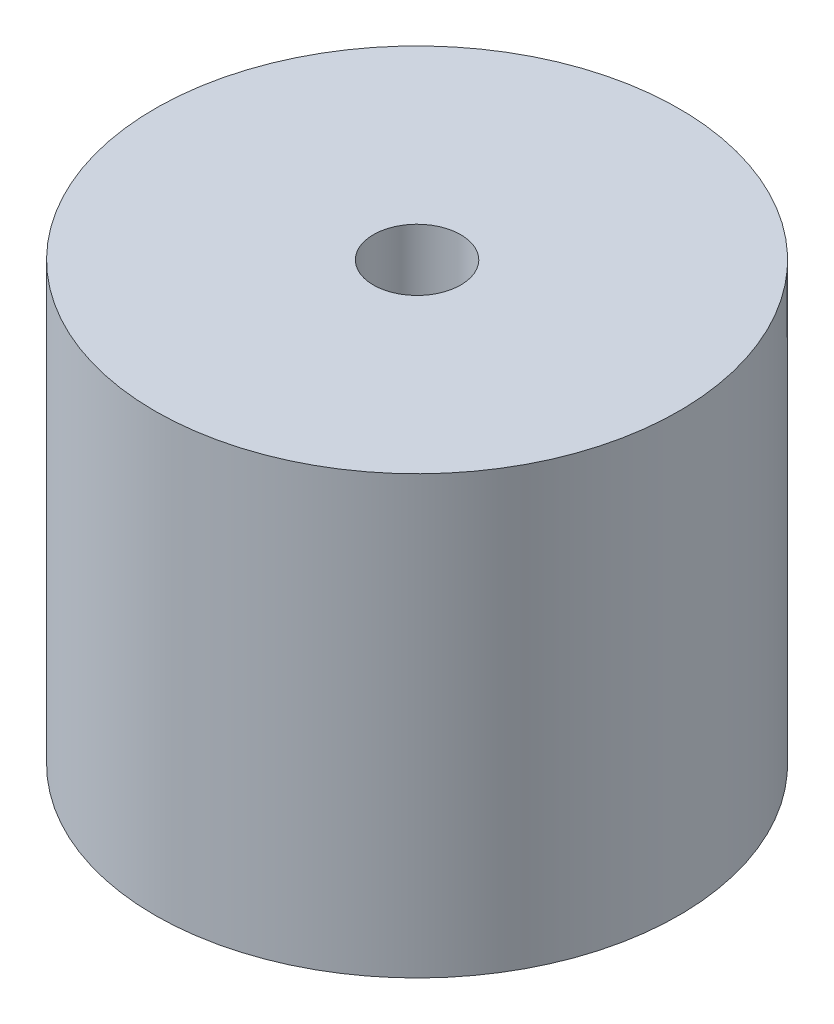
ISO-10303-21;
HEADER;
FILE_DESCRIPTION(('STEP AP214'),'2;1');
FILE_NAME('part.step','',(''),(''),'','','');
FILE_SCHEMA(('AUTOMOTIVE_DESIGN { 1 0 10303 214 1 1 1 1 }'));
ENDSEC;
DATA;
#1=APPLICATION_CONTEXT('core data for automotive mechanical design processes');
#2=APPLICATION_PROTOCOL_DEFINITION('international standard','automotive_design',2000,#1);
#3=PRODUCT_CONTEXT('',#1,'mechanical');
#4=PRODUCT('Part','Part','',(#3));
#5=PRODUCT_RELATED_PRODUCT_CATEGORY('part','',(#4));
#6=PRODUCT_DEFINITION_FORMATION('','',#4);
#7=PRODUCT_DEFINITION_CONTEXT('part definition',#1,'design');
#8=PRODUCT_DEFINITION('design','',#6,#7);
#9=PRODUCT_DEFINITION_SHAPE('','',#8);
#10=(LENGTH_UNIT() NAMED_UNIT(*) SI_UNIT(.MILLI.,.METRE.));
#11=(NAMED_UNIT(*) PLANE_ANGLE_UNIT() SI_UNIT($,.RADIAN.));
#12=(NAMED_UNIT(*) SI_UNIT($,.STERADIAN.) SOLID_ANGLE_UNIT());
#13=UNCERTAINTY_MEASURE_WITH_UNIT(LENGTH_MEASURE(1.E-05),#10,'distance_accuracy_value','');
#14=(GEOMETRIC_REPRESENTATION_CONTEXT(3) GLOBAL_UNCERTAINTY_ASSIGNED_CONTEXT((#13)) GLOBAL_UNIT_ASSIGNED_CONTEXT((#10,
#11,#12)) REPRESENTATION_CONTEXT('',''));
#15=CARTESIAN_POINT('',(0.,0.,0.));
#16=DIRECTION('',(0.,0.,1.));
#17=DIRECTION('',(1.,0.,0.));
#18=AXIS2_PLACEMENT_3D('',#15,#16,#17);
#19=CARTESIAN_POINT('',(0.,30.,0.));
#20=DIRECTION('',(0.,-1.,0.));
#21=DIRECTION('',(0.,0.,-1.));
#22=AXIS2_PLACEMENT_3D('',#19,#20,#21);
#23=CYLINDRICAL_SURFACE('',#22,18.);
#24=CARTESIAN_POINT('',(0.,30.,0.));
#25=DIRECTION('',(0.,1.,0.));
#26=DIRECTION('',(0.,0.,1.));
#27=AXIS2_PLACEMENT_3D('',#24,#25,#26);
#28=CIRCLE('',#27,18.);
#29=CARTESIAN_POINT('',(0.,30.,18.));
#30=VERTEX_POINT('',#29);
#31=EDGE_CURVE('E10',#30,#30,#28,.T.);
#32=ORIENTED_EDGE('',*,*,#31,.F.);
#33=EDGE_LOOP('',(#32));
#34=FACE_BOUND('',#33,.T.);
#35=CARTESIAN_POINT('',(0.,0.,0.));
#36=DIRECTION('',(0.,1.,0.));
#37=DIRECTION('',(0.,0.,1.));
#38=AXIS2_PLACEMENT_3D('',#35,#36,#37);
#39=CIRCLE('',#38,18.);
#40=CARTESIAN_POINT('',(0.,0.,18.));
#41=VERTEX_POINT('',#40);
#42=EDGE_CURVE('E49',#41,#41,#39,.T.);
#43=ORIENTED_EDGE('',*,*,#42,.T.);
#44=EDGE_LOOP('',(#43));
#45=FACE_BOUND('',#44,.T.);
#46=ADVANCED_FACE('F41',(#34,#45),#23,.T.);
#47=CARTESIAN_POINT('',(0.,30.,0.));
#48=DIRECTION('',(0.,1.,0.));
#49=DIRECTION('',(0.,0.,1.));
#50=AXIS2_PLACEMENT_3D('',#47,#48,#49);
#51=PLANE('',#50);
#52=CARTESIAN_POINT('',(0.,30.,0.));
#53=DIRECTION('',(0.,1.,0.));
#54=DIRECTION('',(0.,0.,1.));
#55=AXIS2_PLACEMENT_3D('',#52,#53,#54);
#56=CIRCLE('',#55,3.);
#57=CARTESIAN_POINT('',(0.,30.,3.));
#58=VERTEX_POINT('',#57);
#59=EDGE_CURVE('E55',#58,#58,#56,.T.);
#60=ORIENTED_EDGE('',*,*,#59,.F.);
#61=EDGE_LOOP('',(#60));
#62=FACE_BOUND('',#61,.T.);
#63=ORIENTED_EDGE('',*,*,#31,.T.);
#64=EDGE_LOOP('',(#63));
#65=FACE_BOUND('',#64,.T.);
#66=ADVANCED_FACE('F74',(#62,#65),#51,.T.);
#67=CARTESIAN_POINT('',(0.,0.,0.));
#68=DIRECTION('',(0.,1.,0.));
#69=DIRECTION('',(0.,0.,1.));
#70=AXIS2_PLACEMENT_3D('',#67,#68,#69);
#71=PLANE('',#70);
#72=CARTESIAN_POINT('',(0.,0.,0.));
#73=DIRECTION('',(0.,1.,0.));
#74=DIRECTION('',(0.,0.,1.));
#75=AXIS2_PLACEMENT_3D('',#72,#73,#74);
#76=CIRCLE('',#75,3.);
#77=CARTESIAN_POINT('',(0.,0.,3.));
#78=VERTEX_POINT('',#77);
#79=EDGE_CURVE('E44',#78,#78,#76,.T.);
#80=ORIENTED_EDGE('',*,*,#79,.T.);
#81=EDGE_LOOP('',(#80));
#82=FACE_BOUND('',#81,.T.);
#83=ORIENTED_EDGE('',*,*,#42,.F.);
#84=EDGE_LOOP('',(#83));
#85=FACE_BOUND('',#84,.T.);
#86=ADVANCED_FACE('F65',(#82,#85),#71,.F.);
#87=CARTESIAN_POINT('',(0.,-12.5,0.));
#88=DIRECTION('',(0.,1.,0.));
#89=DIRECTION('',(0.,0.,1.));
#90=AXIS2_PLACEMENT_3D('',#87,#88,#89);
#91=CYLINDRICAL_SURFACE('',#90,3.);
#92=ORIENTED_EDGE('',*,*,#59,.T.);
#93=EDGE_LOOP('',(#92));
#94=FACE_BOUND('',#93,.T.);
#95=ORIENTED_EDGE('',*,*,#79,.F.);
#96=EDGE_LOOP('',(#95));
#97=FACE_BOUND('',#96,.T.);
#98=ADVANCED_FACE('F68',(#94,#97),#91,.F.);
#99=CLOSED_SHELL('',(#46,#66,#86,#98));
#100=MANIFOLD_SOLID_BREP('B2',#99);
#101=ADVANCED_BREP_SHAPE_REPRESENTATION('',(#18,#100),#14);
#102=SHAPE_DEFINITION_REPRESENTATION(#9,#101);
ENDSEC;
END-ISO-10303-21;
